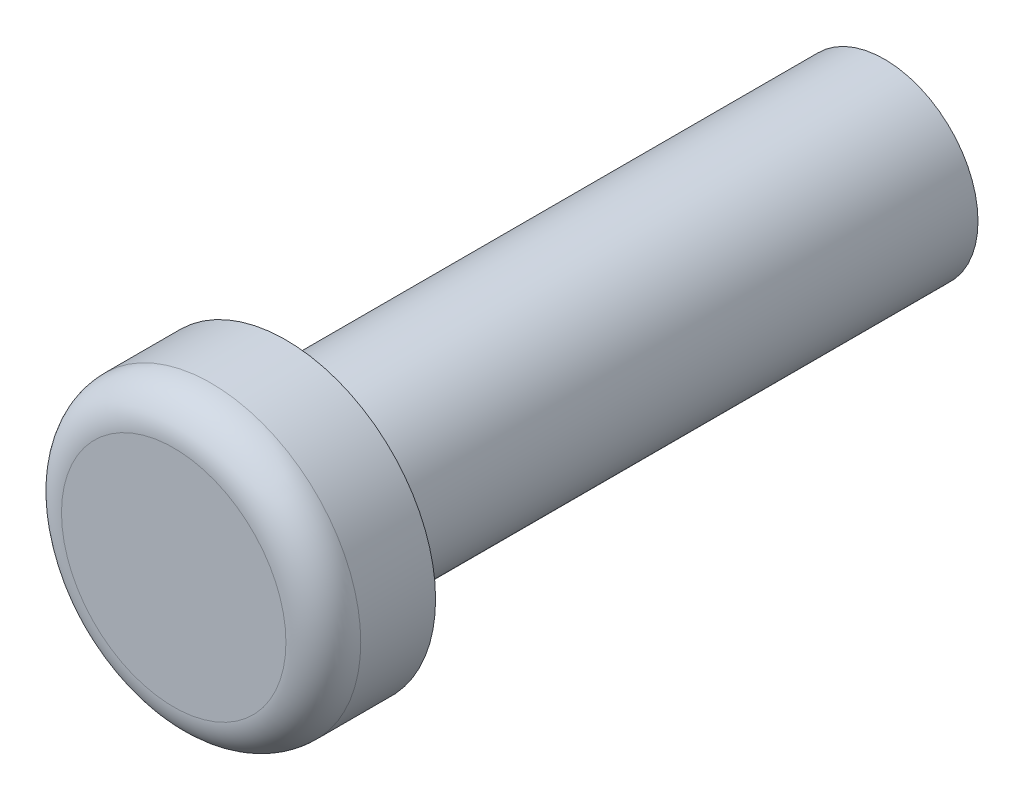
ISO-10303-21;
HEADER;
FILE_DESCRIPTION(('STEP AP214'),'2;1');
FILE_NAME('part.step','',(''),(''),'','','');
FILE_SCHEMA(('AUTOMOTIVE_DESIGN { 1 0 10303 214 1 1 1 1 }'));
ENDSEC;
DATA;
#1=APPLICATION_CONTEXT('core data for automotive mechanical design processes');
#2=APPLICATION_PROTOCOL_DEFINITION('international standard','automotive_design',2000,#1);
#3=PRODUCT_CONTEXT('',#1,'mechanical');
#4=PRODUCT('Part','Part','',(#3));
#5=PRODUCT_RELATED_PRODUCT_CATEGORY('part','',(#4));
#6=PRODUCT_DEFINITION_FORMATION('','',#4);
#7=PRODUCT_DEFINITION_CONTEXT('part definition',#1,'design');
#8=PRODUCT_DEFINITION('design','',#6,#7);
#9=PRODUCT_DEFINITION_SHAPE('','',#8);
#10=(LENGTH_UNIT() NAMED_UNIT(*) SI_UNIT(.MILLI.,.METRE.));
#11=(NAMED_UNIT(*) PLANE_ANGLE_UNIT() SI_UNIT($,.RADIAN.));
#12=(NAMED_UNIT(*) SI_UNIT($,.STERADIAN.) SOLID_ANGLE_UNIT());
#13=UNCERTAINTY_MEASURE_WITH_UNIT(LENGTH_MEASURE(1.E-05),#10,'distance_accuracy_value','');
#14=(GEOMETRIC_REPRESENTATION_CONTEXT(3) GLOBAL_UNCERTAINTY_ASSIGNED_CONTEXT((#13)) GLOBAL_UNIT_ASSIGNED_CONTEXT((#10,
#11,#12)) REPRESENTATION_CONTEXT('',''));
#15=CARTESIAN_POINT('',(0.,0.,0.));
#16=DIRECTION('',(0.,0.,1.));
#17=DIRECTION('',(1.,0.,0.));
#18=AXIS2_PLACEMENT_3D('',#15,#16,#17);
#19=CARTESIAN_POINT('',(-20.,-30.,-16.));
#20=DIRECTION('',(0.,0.,1.));
#21=DIRECTION('',(1.,0.,0.));
#22=AXIS2_PLACEMENT_3D('',#19,#20,#21);
#23=CYLINDRICAL_SURFACE('',#22,2.5);
#24=CARTESIAN_POINT('',(-20.,-30.,-16.));
#25=DIRECTION('',(0.,0.,1.));
#26=DIRECTION('',(1.,0.,0.));
#27=AXIS2_PLACEMENT_3D('',#24,#25,#26);
#28=CIRCLE('',#27,2.5);
#29=CARTESIAN_POINT('',(-17.5,-30.,-16.));
#30=VERTEX_POINT('',#29);
#31=EDGE_CURVE('E42',#30,#30,#28,.T.);
#32=ORIENTED_EDGE('',*,*,#31,.T.);
#33=EDGE_LOOP('',(#32));
#34=FACE_BOUND('',#33,.T.);
#35=CARTESIAN_POINT('',(-20.,-30.,0.));
#36=DIRECTION('',(0.,0.,1.));
#37=DIRECTION('',(1.,0.,0.));
#38=AXIS2_PLACEMENT_3D('',#35,#36,#37);
#39=CIRCLE('',#38,2.5);
#40=CARTESIAN_POINT('',(-17.5,-30.,0.));
#41=VERTEX_POINT('',#40);
#42=EDGE_CURVE('E46',#41,#41,#39,.T.);
#43=ORIENTED_EDGE('',*,*,#42,.F.);
#44=EDGE_LOOP('',(#43));
#45=FACE_BOUND('',#44,.T.);
#46=ADVANCED_FACE('F31',(#34,#45),#23,.T.);
#47=CARTESIAN_POINT('',(-20.,-30.,-16.));
#48=DIRECTION('',(0.,0.,1.));
#49=DIRECTION('',(1.,0.,0.));
#50=AXIS2_PLACEMENT_3D('',#47,#48,#49);
#51=PLANE('',#50);
#52=ORIENTED_EDGE('',*,*,#31,.F.);
#53=EDGE_LOOP('',(#52));
#54=FACE_BOUND('',#53,.T.);
#55=ADVANCED_FACE('F70',(#54),#51,.F.);
#56=CARTESIAN_POINT('',(-20.,-30.,3.));
#57=DIRECTION('',(0.,0.,-1.));
#58=DIRECTION('',(-1.,0.,0.));
#59=AXIS2_PLACEMENT_3D('',#56,#57,#58);
#60=CYLINDRICAL_SURFACE('',#59,4.);
#61=CARTESIAN_POINT('',(-20.,-30.,2.));
#62=DIRECTION('',(0.,0.,1.));
#63=DIRECTION('',(1.,0.,0.));
#64=AXIS2_PLACEMENT_3D('',#61,#62,#63);
#65=CIRCLE('',#64,4.);
#66=CARTESIAN_POINT('',(-16.,-30.,2.));
#67=VERTEX_POINT('',#66);
#68=EDGE_CURVE('E10',#67,#67,#65,.F.);
#69=ORIENTED_EDGE('',*,*,#68,.T.);
#70=EDGE_LOOP('',(#69));
#71=FACE_BOUND('',#70,.T.);
#72=CARTESIAN_POINT('',(-20.,-30.,0.));
#73=DIRECTION('',(0.,0.,1.));
#74=DIRECTION('',(1.,0.,0.));
#75=AXIS2_PLACEMENT_3D('',#72,#73,#74);
#76=CIRCLE('',#75,4.);
#77=CARTESIAN_POINT('',(-16.,-30.,0.));
#78=VERTEX_POINT('',#77);
#79=EDGE_CURVE('E50',#78,#78,#76,.T.);
#80=ORIENTED_EDGE('',*,*,#79,.T.);
#81=EDGE_LOOP('',(#80));
#82=FACE_BOUND('',#81,.T.);
#83=ADVANCED_FACE('F55',(#71,#82),#60,.T.);
#84=CARTESIAN_POINT('',(-20.,-30.,3.));
#85=DIRECTION('',(0.,0.,1.));
#86=DIRECTION('',(1.,0.,0.));
#87=AXIS2_PLACEMENT_3D('',#84,#85,#86);
#88=PLANE('',#87);
#89=CARTESIAN_POINT('',(-20.,-30.,3.));
#90=DIRECTION('',(0.,0.,1.));
#91=DIRECTION('',(1.,0.,0.));
#92=AXIS2_PLACEMENT_3D('',#89,#90,#91);
#93=CIRCLE('',#92,3.);
#94=CARTESIAN_POINT('',(-17.,-30.,3.));
#95=VERTEX_POINT('',#94);
#96=EDGE_CURVE('E38',#95,#95,#93,.T.);
#97=ORIENTED_EDGE('',*,*,#96,.T.);
#98=EDGE_LOOP('',(#97));
#99=FACE_BOUND('',#98,.T.);
#100=ADVANCED_FACE('F59',(#99),#88,.T.);
#101=CARTESIAN_POINT('',(-20.,-30.,0.));
#102=DIRECTION('',(0.,0.,1.));
#103=DIRECTION('',(1.,0.,0.));
#104=AXIS2_PLACEMENT_3D('',#101,#102,#103);
#105=PLANE('',#104);
#106=ORIENTED_EDGE('',*,*,#42,.T.);
#107=EDGE_LOOP('',(#106));
#108=FACE_BOUND('',#107,.T.);
#109=ORIENTED_EDGE('',*,*,#79,.F.);
#110=EDGE_LOOP('',(#109));
#111=FACE_BOUND('',#110,.T.);
#112=ADVANCED_FACE('F57',(#108,#111),#105,.F.);
#113=CARTESIAN_POINT('',(-20.,-30.,2.));
#114=DIRECTION('',(0.,0.,1.));
#115=DIRECTION('',(1.,0.,0.));
#116=AXIS2_PLACEMENT_3D('',#113,#114,#115);
#117=TOROIDAL_SURFACE('',#116,3.,1.);
#118=ORIENTED_EDGE('',*,*,#68,.F.);
#119=EDGE_LOOP('',(#118));
#120=FACE_BOUND('',#119,.T.);
#121=ORIENTED_EDGE('',*,*,#96,.F.);
#122=EDGE_LOOP('',(#121));
#123=FACE_BOUND('',#122,.T.);
#124=ADVANCED_FACE('F33',(#120,#123),#117,.T.);
#125=CLOSED_SHELL('',(#46,#55,#83,#100,#112,#124));
#126=MANIFOLD_SOLID_BREP('B2',#125);
#127=ADVANCED_BREP_SHAPE_REPRESENTATION('',(#18,#126),#14);
#128=SHAPE_DEFINITION_REPRESENTATION(#9,#127);
ENDSEC;
END-ISO-10303-21;
